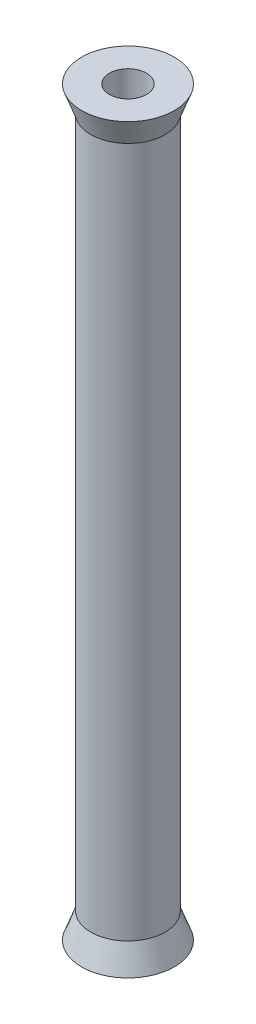
ISO-10303-21;
HEADER;
FILE_DESCRIPTION(('STEP AP214'),'2;1');
FILE_NAME('part.step','',(''),(''),'','','');
FILE_SCHEMA(('AUTOMOTIVE_DESIGN { 1 0 10303 214 1 1 1 1 }'));
ENDSEC;
DATA;
#1=APPLICATION_CONTEXT('core data for automotive mechanical design processes');
#2=APPLICATION_PROTOCOL_DEFINITION('international standard','automotive_design',2000,#1);
#3=PRODUCT_CONTEXT('',#1,'mechanical');
#4=PRODUCT('Part','Part','',(#3));
#5=PRODUCT_RELATED_PRODUCT_CATEGORY('part','',(#4));
#6=PRODUCT_DEFINITION_FORMATION('','',#4);
#7=PRODUCT_DEFINITION_CONTEXT('part definition',#1,'design');
#8=PRODUCT_DEFINITION('design','',#6,#7);
#9=PRODUCT_DEFINITION_SHAPE('','',#8);
#10=(LENGTH_UNIT() NAMED_UNIT(*) SI_UNIT(.MILLI.,.METRE.));
#11=(NAMED_UNIT(*) PLANE_ANGLE_UNIT() SI_UNIT($,.RADIAN.));
#12=(NAMED_UNIT(*) SI_UNIT($,.STERADIAN.) SOLID_ANGLE_UNIT());
#13=UNCERTAINTY_MEASURE_WITH_UNIT(LENGTH_MEASURE(1.E-05),#10,'distance_accuracy_value','');
#14=(GEOMETRIC_REPRESENTATION_CONTEXT(3) GLOBAL_UNCERTAINTY_ASSIGNED_CONTEXT((#13)) GLOBAL_UNIT_ASSIGNED_CONTEXT((#10,
#11,#12)) REPRESENTATION_CONTEXT('',''));
#15=CARTESIAN_POINT('',(0.,0.,0.));
#16=DIRECTION('',(0.,0.,1.));
#17=DIRECTION('',(1.,0.,0.));
#18=AXIS2_PLACEMENT_3D('',#15,#16,#17);
#19=CARTESIAN_POINT('',(0.,37.2525225805454,0.));
#20=DIRECTION('',(0.,1.,0.));
#21=DIRECTION('',(0.,0.,1.));
#22=AXIS2_PLACEMENT_3D('',#19,#20,#21);
#23=CONICAL_SURFACE('',#22,4.,0.34906585039887);
#24=CARTESIAN_POINT('',(0.,40.,0.));
#25=DIRECTION('',(0.,1.,0.));
#26=DIRECTION('',(0.,0.,1.));
#27=AXIS2_PLACEMENT_3D('',#24,#25,#26);
#28=CIRCLE('',#27,4.99999999999999);
#29=CARTESIAN_POINT('',(0.,40.,4.99999999999999));
#30=VERTEX_POINT('',#29);
#31=EDGE_CURVE('E10',#30,#30,#28,.T.);
#32=ORIENTED_EDGE('',*,*,#31,.F.);
#33=EDGE_LOOP('',(#32));
#34=FACE_BOUND('',#33,.T.);
#35=CARTESIAN_POINT('',(0.,37.2525225805454,0.));
#36=DIRECTION('',(0.,1.,0.));
#37=DIRECTION('',(0.,0.,1.));
#38=AXIS2_PLACEMENT_3D('',#35,#36,#37);
#39=CIRCLE('',#38,4.);
#40=CARTESIAN_POINT('',(0.,37.2525225805454,4.));
#41=VERTEX_POINT('',#40);
#42=EDGE_CURVE('E59',#41,#41,#39,.T.);
#43=ORIENTED_EDGE('',*,*,#42,.T.);
#44=EDGE_LOOP('',(#43));
#45=FACE_BOUND('',#44,.T.);
#46=ADVANCED_FACE('F37',(#34,#45),#23,.T.);
#47=CARTESIAN_POINT('',(2.,40.,0.));
#48=DIRECTION('',(0.,-1.,0.));
#49=DIRECTION('',(0.,0.,-1.));
#50=AXIS2_PLACEMENT_3D('',#47,#48,#49);
#51=PLANE('',#50);
#52=CARTESIAN_POINT('',(0.,40.,0.));
#53=DIRECTION('',(0.,1.,0.));
#54=DIRECTION('',(0.,0.,1.));
#55=AXIS2_PLACEMENT_3D('',#52,#53,#54);
#56=CIRCLE('',#55,2.);
#57=CARTESIAN_POINT('',(0.,40.,2.));
#58=VERTEX_POINT('',#57);
#59=EDGE_CURVE('E43',#58,#58,#56,.T.);
#60=ORIENTED_EDGE('',*,*,#59,.F.);
#61=EDGE_LOOP('',(#60));
#62=FACE_BOUND('',#61,.T.);
#63=ORIENTED_EDGE('',*,*,#31,.T.);
#64=EDGE_LOOP('',(#63));
#65=FACE_BOUND('',#64,.T.);
#66=ADVANCED_FACE('F84',(#62,#65),#51,.F.);
#67=CARTESIAN_POINT('',(0.,0.,0.));
#68=DIRECTION('',(0.,1.,0.));
#69=DIRECTION('',(0.,0.,1.));
#70=AXIS2_PLACEMENT_3D('',#67,#68,#69);
#71=CYLINDRICAL_SURFACE('',#70,2.);
#72=CARTESIAN_POINT('',(0.,-40.,0.));
#73=DIRECTION('',(0.,1.,0.));
#74=DIRECTION('',(0.,0.,1.));
#75=AXIS2_PLACEMENT_3D('',#72,#73,#74);
#76=CIRCLE('',#75,2.);
#77=CARTESIAN_POINT('',(0.,-40.,2.));
#78=VERTEX_POINT('',#77);
#79=EDGE_CURVE('E47',#78,#78,#76,.T.);
#80=ORIENTED_EDGE('',*,*,#79,.F.);
#81=EDGE_LOOP('',(#80));
#82=FACE_BOUND('',#81,.T.);
#83=ORIENTED_EDGE('',*,*,#59,.T.);
#84=EDGE_LOOP('',(#83));
#85=FACE_BOUND('',#84,.T.);
#86=ADVANCED_FACE('F79',(#82,#85),#71,.F.);
#87=CARTESIAN_POINT('',(2.,-40.,0.));
#88=DIRECTION('',(0.,1.,0.));
#89=DIRECTION('',(0.,0.,1.));
#90=AXIS2_PLACEMENT_3D('',#87,#88,#89);
#91=PLANE('',#90);
#92=CARTESIAN_POINT('',(0.,-40.,0.));
#93=DIRECTION('',(0.,1.,0.));
#94=DIRECTION('',(0.,0.,1.));
#95=AXIS2_PLACEMENT_3D('',#92,#93,#94);
#96=CIRCLE('',#95,4.99999999999999);
#97=CARTESIAN_POINT('',(0.,-40.,4.99999999999999));
#98=VERTEX_POINT('',#97);
#99=EDGE_CURVE('E51',#98,#98,#96,.T.);
#100=ORIENTED_EDGE('',*,*,#99,.F.);
#101=EDGE_LOOP('',(#100));
#102=FACE_BOUND('',#101,.T.);
#103=ORIENTED_EDGE('',*,*,#79,.T.);
#104=EDGE_LOOP('',(#103));
#105=FACE_BOUND('',#104,.T.);
#106=ADVANCED_FACE('F73',(#102,#105),#91,.F.);
#107=CARTESIAN_POINT('',(0.,-40.,0.));
#108=DIRECTION('',(0.,-1.,0.));
#109=DIRECTION('',(0.,0.,-1.));
#110=AXIS2_PLACEMENT_3D('',#107,#108,#109);
#111=CONICAL_SURFACE('',#110,4.99999999999999,0.34906585039887);
#112=CARTESIAN_POINT('',(0.,-37.2525225805454,0.));
#113=DIRECTION('',(0.,1.,0.));
#114=DIRECTION('',(0.,0.,1.));
#115=AXIS2_PLACEMENT_3D('',#112,#113,#114);
#116=CIRCLE('',#115,4.);
#117=CARTESIAN_POINT('',(0.,-37.2525225805454,4.));
#118=VERTEX_POINT('',#117);
#119=EDGE_CURVE('E56',#118,#118,#116,.T.);
#120=ORIENTED_EDGE('',*,*,#119,.F.);
#121=EDGE_LOOP('',(#120));
#122=FACE_BOUND('',#121,.T.);
#123=ORIENTED_EDGE('',*,*,#99,.T.);
#124=EDGE_LOOP('',(#123));
#125=FACE_BOUND('',#124,.T.);
#126=ADVANCED_FACE('F67',(#122,#125),#111,.T.);
#127=CARTESIAN_POINT('',(0.,0.,0.));
#128=DIRECTION('',(0.,1.,0.));
#129=DIRECTION('',(0.,0.,1.));
#130=AXIS2_PLACEMENT_3D('',#127,#128,#129);
#131=CYLINDRICAL_SURFACE('',#130,4.);
#132=ORIENTED_EDGE('',*,*,#42,.F.);
#133=EDGE_LOOP('',(#132));
#134=FACE_BOUND('',#133,.T.);
#135=ORIENTED_EDGE('',*,*,#119,.T.);
#136=EDGE_LOOP('',(#135));
#137=FACE_BOUND('',#136,.T.);
#138=ADVANCED_FACE('F64',(#134,#137),#131,.T.);
#139=CLOSED_SHELL('',(#46,#66,#86,#106,#126,#138));
#140=MANIFOLD_SOLID_BREP('B2',#139);
#141=ADVANCED_BREP_SHAPE_REPRESENTATION('',(#18,#140),#14);
#142=SHAPE_DEFINITION_REPRESENTATION(#9,#141);
ENDSEC;
END-ISO-10303-21;
